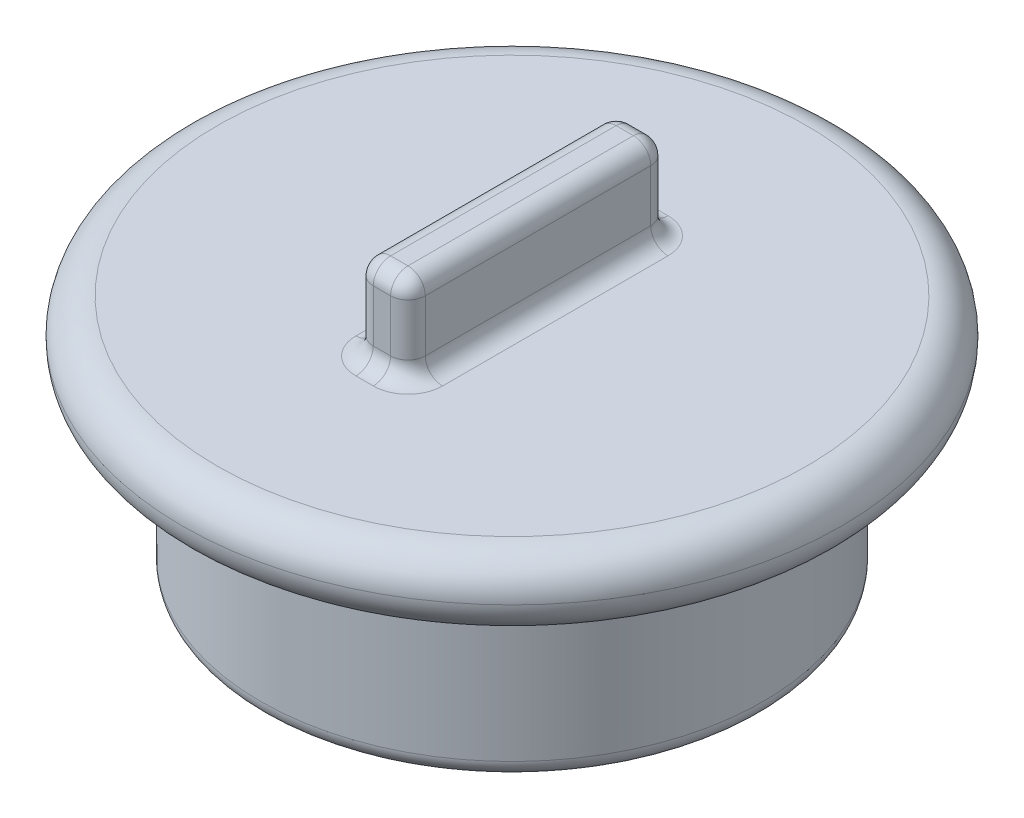
ISO-10303-21;
HEADER;
FILE_DESCRIPTION(('STEP AP214'),'2;1');
FILE_NAME('part.step','',(''),(''),'','','');
FILE_SCHEMA(('AUTOMOTIVE_DESIGN { 1 0 10303 214 1 1 1 1 }'));
ENDSEC;
DATA;
#1=APPLICATION_CONTEXT('core data for automotive mechanical design processes');
#2=APPLICATION_PROTOCOL_DEFINITION('international standard','automotive_design',2000,#1);
#3=PRODUCT_CONTEXT('',#1,'mechanical');
#4=PRODUCT('Part','Part','',(#3));
#5=PRODUCT_RELATED_PRODUCT_CATEGORY('part','',(#4));
#6=PRODUCT_DEFINITION_FORMATION('','',#4);
#7=PRODUCT_DEFINITION_CONTEXT('part definition',#1,'design');
#8=PRODUCT_DEFINITION('design','',#6,#7);
#9=PRODUCT_DEFINITION_SHAPE('','',#8);
#10=(LENGTH_UNIT() NAMED_UNIT(*) SI_UNIT(.MILLI.,.METRE.));
#11=(NAMED_UNIT(*) PLANE_ANGLE_UNIT() SI_UNIT($,.RADIAN.));
#12=(NAMED_UNIT(*) SI_UNIT($,.STERADIAN.) SOLID_ANGLE_UNIT());
#13=UNCERTAINTY_MEASURE_WITH_UNIT(LENGTH_MEASURE(1.E-05),#10,'distance_accuracy_value','');
#14=(GEOMETRIC_REPRESENTATION_CONTEXT(3) GLOBAL_UNCERTAINTY_ASSIGNED_CONTEXT((#13)) GLOBAL_UNIT_ASSIGNED_CONTEXT((#10,
#11,#12)) REPRESENTATION_CONTEXT('',''));
#15=CARTESIAN_POINT('',(0.,0.,0.));
#16=DIRECTION('',(0.,0.,1.));
#17=DIRECTION('',(1.,0.,0.));
#18=AXIS2_PLACEMENT_3D('',#15,#16,#17);
#19=CARTESIAN_POINT('',(0.,4.,0.));
#20=DIRECTION('',(0.,1.,0.));
#21=DIRECTION('',(0.,0.,1.));
#22=AXIS2_PLACEMENT_3D('',#19,#20,#21);
#23=PLANE('',#22);
#24=CARTESIAN_POINT('',(0.,4.,0.));
#25=DIRECTION('',(0.,1.,0.));
#26=DIRECTION('',(0.,0.,1.));
#27=AXIS2_PLACEMENT_3D('',#24,#25,#26);
#28=CIRCLE('',#27,17.);
#29=CARTESIAN_POINT('',(0.,4.,17.));
#30=VERTEX_POINT('',#29);
#31=EDGE_CURVE('E245',#30,#30,#28,.T.);
#32=ORIENTED_EDGE('',*,*,#31,.T.);
#33=EDGE_LOOP('',(#32));
#34=FACE_BOUND('',#33,.T.);
#35=CARTESIAN_POINT('',(0.500000000000001,4.,6.5));
#36=DIRECTION('',(0.,1.,0.));
#37=DIRECTION('',(0.,0.,1.));
#38=AXIS2_PLACEMENT_3D('',#35,#36,#37);
#39=CIRCLE('',#38,2.);
#40=CARTESIAN_POINT('',(0.500000000000001,4.,8.5));
#41=VERTEX_POINT('',#40);
#42=CARTESIAN_POINT('',(2.5,4.,6.5));
#43=VERTEX_POINT('',#42);
#44=EDGE_CURVE('E641',#41,#43,#39,.T.);
#45=ORIENTED_EDGE('',*,*,#44,.F.);
#46=DIRECTION('',(1.,0.,0.));
#47=VECTOR('',#46,1.);
#48=CARTESIAN_POINT('',(0.,4.,8.5));
#49=LINE('',#48,#47);
#50=CARTESIAN_POINT('',(-0.499999999999999,4.,8.5));
#51=VERTEX_POINT('',#50);
#52=EDGE_CURVE('E638',#41,#51,#49,.F.);
#53=ORIENTED_EDGE('',*,*,#52,.T.);
#54=CARTESIAN_POINT('',(-0.499999999999999,4.,6.5));
#55=DIRECTION('',(0.,1.,0.));
#56=DIRECTION('',(0.,0.,1.));
#57=AXIS2_PLACEMENT_3D('',#54,#55,#56);
#58=CIRCLE('',#57,2.);
#59=CARTESIAN_POINT('',(-2.5,4.,6.5));
#60=VERTEX_POINT('',#59);
#61=EDGE_CURVE('E634',#60,#51,#58,.T.);
#62=ORIENTED_EDGE('',*,*,#61,.F.);
#63=DIRECTION('',(0.,0.,1.));
#64=VECTOR('',#63,1.);
#65=CARTESIAN_POINT('',(-2.5,4.,0.));
#66=LINE('',#65,#64);
#67=CARTESIAN_POINT('',(-2.5,4.,-6.5));
#68=VERTEX_POINT('',#67);
#69=EDGE_CURVE('E620',#60,#68,#66,.F.);
#70=ORIENTED_EDGE('',*,*,#69,.T.);
#71=CARTESIAN_POINT('',(-0.500000000000001,4.,-6.5));
#72=DIRECTION('',(0.,1.,0.));
#73=DIRECTION('',(0.,0.,1.));
#74=AXIS2_PLACEMENT_3D('',#71,#72,#73);
#75=CIRCLE('',#74,2.);
#76=CARTESIAN_POINT('',(-0.5,4.,-8.5));
#77=VERTEX_POINT('',#76);
#78=EDGE_CURVE('E617',#77,#68,#75,.T.);
#79=ORIENTED_EDGE('',*,*,#78,.F.);
#80=DIRECTION('',(-1.,0.,0.));
#81=VECTOR('',#80,1.);
#82=CARTESIAN_POINT('',(0.,4.,-8.5));
#83=LINE('',#82,#81);
#84=CARTESIAN_POINT('',(0.5,4.,-8.5));
#85=VERTEX_POINT('',#84);
#86=EDGE_CURVE('E621',#77,#85,#83,.F.);
#87=ORIENTED_EDGE('',*,*,#86,.T.);
#88=CARTESIAN_POINT('',(0.499999999999999,4.,-6.5));
#89=DIRECTION('',(0.,1.,0.));
#90=DIRECTION('',(0.,0.,1.));
#91=AXIS2_PLACEMENT_3D('',#88,#89,#90);
#92=CIRCLE('',#91,2.);
#93=CARTESIAN_POINT('',(2.5,4.,-6.5));
#94=VERTEX_POINT('',#93);
#95=EDGE_CURVE('E627',#94,#85,#92,.T.);
#96=ORIENTED_EDGE('',*,*,#95,.F.);
#97=DIRECTION('',(0.,0.,-1.));
#98=VECTOR('',#97,1.);
#99=CARTESIAN_POINT('',(2.5,4.,0.));
#100=LINE('',#99,#98);
#101=EDGE_CURVE('E625',#94,#43,#100,.F.);
#102=ORIENTED_EDGE('',*,*,#101,.T.);
#103=EDGE_LOOP('',(#45,#53,#62,#70,#79,#87,#96,#102));
#104=FACE_BOUND('',#103,.T.);
#105=ADVANCED_FACE('F41',(#34,#104),#23,.T.);
#106=CARTESIAN_POINT('',(0.,0.,0.));
#107=DIRECTION('',(0.,1.,0.));
#108=DIRECTION('',(0.,0.,1.));
#109=AXIS2_PLACEMENT_3D('',#106,#107,#108);
#110=PLANE('',#109);
#111=CARTESIAN_POINT('',(0.,0.,0.));
#112=DIRECTION('',(0.,1.,0.));
#113=DIRECTION('',(0.,0.,1.));
#114=AXIS2_PLACEMENT_3D('',#111,#112,#113);
#115=CIRCLE('',#114,14.5);
#116=CARTESIAN_POINT('',(0.,0.,14.5));
#117=VERTEX_POINT('',#116);
#118=EDGE_CURVE('E249',#117,#117,#115,.F.);
#119=ORIENTED_EDGE('',*,*,#118,.F.);
#120=EDGE_LOOP('',(#119));
#121=FACE_BOUND('',#120,.T.);
#122=CARTESIAN_POINT('',(0.,0.,0.));
#123=DIRECTION('',(0.,1.,0.));
#124=DIRECTION('',(0.,0.,1.));
#125=AXIS2_PLACEMENT_3D('',#122,#123,#124);
#126=CIRCLE('',#125,17.);
#127=CARTESIAN_POINT('',(0.,0.,17.));
#128=VERTEX_POINT('',#127);
#129=EDGE_CURVE('E241',#128,#128,#126,.F.);
#130=ORIENTED_EDGE('',*,*,#129,.T.);
#131=EDGE_LOOP('',(#130));
#132=FACE_BOUND('',#131,.T.);
#133=ADVANCED_FACE('F277',(#121,#132),#110,.F.);
#134=CARTESIAN_POINT('',(-1.5,9.,-7.5));
#135=DIRECTION('',(1.,0.,0.));
#136=DIRECTION('',(0.,0.,-1.));
#137=AXIS2_PLACEMENT_3D('',#134,#135,#136);
#138=PLANE('',#137);
#139=DIRECTION('',(0.,-1.,0.));
#140=VECTOR('',#139,1.);
#141=CARTESIAN_POINT('',(-1.5,9.,-6.5));
#142=LINE('',#141,#140);
#143=CARTESIAN_POINT('',(-1.5,8.,-6.5));
#144=VERTEX_POINT('',#143);
#145=CARTESIAN_POINT('',(-1.5,5.,-6.5));
#146=VERTEX_POINT('',#145);
#147=EDGE_CURVE('E598',#144,#146,#142,.T.);
#148=ORIENTED_EDGE('',*,*,#147,.T.);
#149=DIRECTION('',(0.,0.,1.));
#150=VECTOR('',#149,1.);
#151=CARTESIAN_POINT('',(-1.5,5.,-7.5));
#152=LINE('',#151,#150);
#153=CARTESIAN_POINT('',(-1.5,5.,6.5));
#154=VERTEX_POINT('',#153);
#155=EDGE_CURVE('E600',#146,#154,#152,.T.);
#156=ORIENTED_EDGE('',*,*,#155,.T.);
#157=DIRECTION('',(0.,-1.,0.));
#158=VECTOR('',#157,1.);
#159=CARTESIAN_POINT('',(-1.5,9.,6.5));
#160=LINE('',#159,#158);
#161=CARTESIAN_POINT('',(-1.5,8.,6.5));
#162=VERTEX_POINT('',#161);
#163=EDGE_CURVE('E606',#154,#162,#160,.F.);
#164=ORIENTED_EDGE('',*,*,#163,.T.);
#165=DIRECTION('',(0.,0.,1.));
#166=VECTOR('',#165,1.);
#167=CARTESIAN_POINT('',(-1.5,8.,-7.5));
#168=LINE('',#167,#166);
#169=EDGE_CURVE('E602',#162,#144,#168,.F.);
#170=ORIENTED_EDGE('',*,*,#169,.T.);
#171=EDGE_LOOP('',(#148,#156,#164,#170));
#172=FACE_BOUND('',#171,.T.);
#173=ADVANCED_FACE('F283',(#172),#138,.F.);
#174=CARTESIAN_POINT('',(-1.5,9.,7.5));
#175=DIRECTION('',(0.,0.,-1.));
#176=DIRECTION('',(-1.,0.,0.));
#177=AXIS2_PLACEMENT_3D('',#174,#175,#176);
#178=PLANE('',#177);
#179=DIRECTION('',(1.,0.,0.));
#180=VECTOR('',#179,1.);
#181=CARTESIAN_POINT('',(-1.5,8.,7.5));
#182=LINE('',#181,#180);
#183=CARTESIAN_POINT('',(0.500000000000001,8.,7.5));
#184=VERTEX_POINT('',#183);
#185=CARTESIAN_POINT('',(-0.499999999999999,8.,7.5));
#186=VERTEX_POINT('',#185);
#187=EDGE_CURVE('E654',#184,#186,#182,.F.);
#188=ORIENTED_EDGE('',*,*,#187,.T.);
#189=DIRECTION('',(0.,-1.,0.));
#190=VECTOR('',#189,1.);
#191=CARTESIAN_POINT('',(-0.499999999999999,9.,7.5));
#192=LINE('',#191,#190);
#193=CARTESIAN_POINT('',(-0.499999999999999,5.,7.5));
#194=VERTEX_POINT('',#193);
#195=EDGE_CURVE('E657',#186,#194,#192,.T.);
#196=ORIENTED_EDGE('',*,*,#195,.T.);
#197=DIRECTION('',(1.,0.,0.));
#198=VECTOR('',#197,1.);
#199=CARTESIAN_POINT('',(-1.5,5.,7.5));
#200=LINE('',#199,#198);
#201=CARTESIAN_POINT('',(0.500000000000001,5.,7.5));
#202=VERTEX_POINT('',#201);
#203=EDGE_CURVE('E614',#194,#202,#200,.T.);
#204=ORIENTED_EDGE('',*,*,#203,.T.);
#205=DIRECTION('',(0.,-1.,0.));
#206=VECTOR('',#205,1.);
#207=CARTESIAN_POINT('',(0.500000000000001,9.,7.5));
#208=LINE('',#207,#206);
#209=EDGE_CURVE('E651',#202,#184,#208,.F.);
#210=ORIENTED_EDGE('',*,*,#209,.T.);
#211=EDGE_LOOP('',(#188,#196,#204,#210));
#212=FACE_BOUND('',#211,.T.);
#213=ADVANCED_FACE('F551',(#212),#178,.F.);
#214=CARTESIAN_POINT('',(1.5,9.,-7.5));
#215=DIRECTION('',(-1.,0.,0.));
#216=DIRECTION('',(0.,0.,1.));
#217=AXIS2_PLACEMENT_3D('',#214,#215,#216);
#218=PLANE('',#217);
#219=DIRECTION('',(0.,-1.,0.));
#220=VECTOR('',#219,1.);
#221=CARTESIAN_POINT('',(1.5,9.,6.5));
#222=LINE('',#221,#220);
#223=CARTESIAN_POINT('',(1.5,8.,6.5));
#224=VERTEX_POINT('',#223);
#225=CARTESIAN_POINT('',(1.5,5.,6.5));
#226=VERTEX_POINT('',#225);
#227=EDGE_CURVE('E155',#224,#226,#222,.T.);
#228=ORIENTED_EDGE('',*,*,#227,.T.);
#229=DIRECTION('',(0.,0.,-1.));
#230=VECTOR('',#229,1.);
#231=CARTESIAN_POINT('',(1.5,5.,-7.5));
#232=LINE('',#231,#230);
#233=CARTESIAN_POINT('',(1.5,5.,-6.5));
#234=VERTEX_POINT('',#233);
#235=EDGE_CURVE('E150',#226,#234,#232,.T.);
#236=ORIENTED_EDGE('',*,*,#235,.T.);
#237=DIRECTION('',(0.,-1.,0.));
#238=VECTOR('',#237,1.);
#239=CARTESIAN_POINT('',(1.5,9.,-6.5));
#240=LINE('',#239,#238);
#241=CARTESIAN_POINT('',(1.5,8.,-6.5));
#242=VERTEX_POINT('',#241);
#243=EDGE_CURVE('E144',#234,#242,#240,.F.);
#244=ORIENTED_EDGE('',*,*,#243,.T.);
#245=DIRECTION('',(0.,0.,-1.));
#246=VECTOR('',#245,1.);
#247=CARTESIAN_POINT('',(1.5,8.,7.5));
#248=LINE('',#247,#246);
#249=EDGE_CURVE('E147',#242,#224,#248,.F.);
#250=ORIENTED_EDGE('',*,*,#249,.T.);
#251=EDGE_LOOP('',(#228,#236,#244,#250));
#252=FACE_BOUND('',#251,.T.);
#253=ADVANCED_FACE('F146',(#252),#218,.F.);
#254=CARTESIAN_POINT('',(-1.5,9.,-7.5));
#255=DIRECTION('',(0.,0.,1.));
#256=DIRECTION('',(1.,0.,0.));
#257=AXIS2_PLACEMENT_3D('',#254,#255,#256);
#258=PLANE('',#257);
#259=DIRECTION('',(-1.,0.,0.));
#260=VECTOR('',#259,1.);
#261=CARTESIAN_POINT('',(1.5,8.,-7.5));
#262=LINE('',#261,#260);
#263=CARTESIAN_POINT('',(-0.5,8.,-7.5));
#264=VERTEX_POINT('',#263);
#265=CARTESIAN_POINT('',(0.499999999999999,8.,-7.5));
#266=VERTEX_POINT('',#265);
#267=EDGE_CURVE('E58',#264,#266,#262,.F.);
#268=ORIENTED_EDGE('',*,*,#267,.T.);
#269=DIRECTION('',(0.,-1.,0.));
#270=VECTOR('',#269,1.);
#271=CARTESIAN_POINT('',(0.499999999999999,9.,-7.5));
#272=LINE('',#271,#270);
#273=CARTESIAN_POINT('',(0.499999999999999,5.,-7.5));
#274=VERTEX_POINT('',#273);
#275=EDGE_CURVE('E178',#266,#274,#272,.T.);
#276=ORIENTED_EDGE('',*,*,#275,.T.);
#277=DIRECTION('',(-1.,0.,0.));
#278=VECTOR('',#277,1.);
#279=CARTESIAN_POINT('',(-1.5,5.,-7.5));
#280=LINE('',#279,#278);
#281=CARTESIAN_POINT('',(-0.5,5.,-7.5));
#282=VERTEX_POINT('',#281);
#283=EDGE_CURVE('E674',#274,#282,#280,.T.);
#284=ORIENTED_EDGE('',*,*,#283,.T.);
#285=DIRECTION('',(0.,-1.,0.));
#286=VECTOR('',#285,1.);
#287=CARTESIAN_POINT('',(-0.5,9.,-7.5));
#288=LINE('',#287,#286);
#289=EDGE_CURVE('E63',#282,#264,#288,.F.);
#290=ORIENTED_EDGE('',*,*,#289,.T.);
#291=EDGE_LOOP('',(#268,#276,#284,#290));
#292=FACE_BOUND('',#291,.T.);
#293=ADVANCED_FACE('F535',(#292),#258,.F.);
#294=CARTESIAN_POINT('',(0.,9.,0.));
#295=DIRECTION('',(0.,1.,0.));
#296=DIRECTION('',(0.,0.,1.));
#297=AXIS2_PLACEMENT_3D('',#294,#295,#296);
#298=PLANE('',#297);
#299=DIRECTION('',(-1.,0.,0.));
#300=VECTOR('',#299,1.);
#301=CARTESIAN_POINT('',(-1.5,9.,-6.5));
#302=LINE('',#301,#300);
#303=CARTESIAN_POINT('',(0.499999999999999,9.,-6.5));
#304=VERTEX_POINT('',#303);
#305=CARTESIAN_POINT('',(-0.500000000000001,9.,-6.5));
#306=VERTEX_POINT('',#305);
#307=EDGE_CURVE('E664',#304,#306,#302,.T.);
#308=ORIENTED_EDGE('',*,*,#307,.T.);
#309=DIRECTION('',(0.,0.,1.));
#310=VECTOR('',#309,1.);
#311=CARTESIAN_POINT('',(-0.499999999999999,9.,7.5));
#312=LINE('',#311,#310);
#313=CARTESIAN_POINT('',(-0.499999999999999,9.,6.5));
#314=VERTEX_POINT('',#313);
#315=EDGE_CURVE('E671',#306,#314,#312,.T.);
#316=ORIENTED_EDGE('',*,*,#315,.T.);
#317=DIRECTION('',(1.,0.,0.));
#318=VECTOR('',#317,1.);
#319=CARTESIAN_POINT('',(1.5,9.,6.5));
#320=LINE('',#319,#318);
#321=CARTESIAN_POINT('',(0.500000000000001,9.,6.5));
#322=VERTEX_POINT('',#321);
#323=EDGE_CURVE('E667',#314,#322,#320,.T.);
#324=ORIENTED_EDGE('',*,*,#323,.T.);
#325=DIRECTION('',(0.,0.,-1.));
#326=VECTOR('',#325,1.);
#327=CARTESIAN_POINT('',(0.499999999999999,9.,-7.5));
#328=LINE('',#327,#326);
#329=EDGE_CURVE('E661',#322,#304,#328,.T.);
#330=ORIENTED_EDGE('',*,*,#329,.T.);
#331=EDGE_LOOP('',(#308,#316,#324,#330));
#332=FACE_BOUND('',#331,.T.);
#333=ADVANCED_FACE('F364',(#332),#298,.T.);
#334=CARTESIAN_POINT('',(-0.5,8.,0.));
#335=DIRECTION('',(0.,0.,-1.));
#336=DIRECTION('',(-1.,0.,0.));
#337=AXIS2_PLACEMENT_3D('',#334,#335,#336);
#338=CYLINDRICAL_SURFACE('',#337,1.);
#339=CARTESIAN_POINT('',(-0.499999999999999,8.,6.5));
#340=DIRECTION('',(0.,0.,1.));
#341=DIRECTION('',(1.,0.,0.));
#342=AXIS2_PLACEMENT_3D('',#339,#340,#341);
#343=CIRCLE('',#342,1.);
#344=EDGE_CURVE('E167',#314,#162,#343,.T.);
#345=ORIENTED_EDGE('',*,*,#344,.F.);
#346=ORIENTED_EDGE('',*,*,#315,.F.);
#347=CARTESIAN_POINT('',(-0.500000000000001,8.,-6.5));
#348=DIRECTION('',(0.,0.,-1.));
#349=DIRECTION('',(-1.,0.,0.));
#350=AXIS2_PLACEMENT_3D('',#347,#348,#349);
#351=CIRCLE('',#350,1.);
#352=EDGE_CURVE('E234',#144,#306,#351,.T.);
#353=ORIENTED_EDGE('',*,*,#352,.F.);
#354=ORIENTED_EDGE('',*,*,#169,.F.);
#355=EDGE_LOOP('',(#345,#346,#353,#354));
#356=FACE_BOUND('',#355,.T.);
#357=ADVANCED_FACE('F360',(#356),#338,.T.);
#358=CARTESIAN_POINT('',(-0.499999999999999,8.,6.5));
#359=DIRECTION('',(-1.,0.,0.));
#360=DIRECTION('',(0.,0.,1.));
#361=AXIS2_PLACEMENT_3D('',#358,#359,#360);
#362=SPHERICAL_SURFACE('',#361,1.);
#363=CARTESIAN_POINT('',(-0.499999999999999,8.,6.5));
#364=DIRECTION('',(-1.,0.,0.));
#365=DIRECTION('',(0.,-1.,0.));
#366=AXIS2_PLACEMENT_3D('',#363,#364,#365);
#367=CIRCLE('',#366,1.);
#368=EDGE_CURVE('E226',#314,#186,#367,.F.);
#369=ORIENTED_EDGE('',*,*,#368,.F.);
#370=ORIENTED_EDGE('',*,*,#344,.T.);
#371=CARTESIAN_POINT('',(-0.499999999999999,8.,6.5));
#372=DIRECTION('',(0.,1.,0.));
#373=DIRECTION('',(0.,0.,1.));
#374=AXIS2_PLACEMENT_3D('',#371,#372,#373);
#375=CIRCLE('',#374,1.);
#376=EDGE_CURVE('E230',#186,#162,#375,.F.);
#377=ORIENTED_EDGE('',*,*,#376,.F.);
#378=EDGE_LOOP('',(#369,#370,#377));
#379=FACE_BOUND('',#378,.T.);
#380=ADVANCED_FACE('F356',(#379),#362,.T.);
#381=CARTESIAN_POINT('',(-0.500000000000001,8.,-6.5));
#382=DIRECTION('',(0.,1.,0.));
#383=DIRECTION('',(0.,0.,1.));
#384=AXIS2_PLACEMENT_3D('',#381,#382,#383);
#385=SPHERICAL_SURFACE('',#384,1.);
#386=CARTESIAN_POINT('',(-0.500000000000001,8.,-6.5));
#387=DIRECTION('',(0.,1.,0.));
#388=DIRECTION('',(0.,0.,1.));
#389=AXIS2_PLACEMENT_3D('',#386,#387,#388);
#390=CIRCLE('',#389,1.);
#391=EDGE_CURVE('E219',#144,#264,#390,.F.);
#392=ORIENTED_EDGE('',*,*,#391,.F.);
#393=ORIENTED_EDGE('',*,*,#352,.T.);
#394=CARTESIAN_POINT('',(-0.500000000000001,8.,-6.5));
#395=DIRECTION('',(-1.,0.,0.));
#396=DIRECTION('',(0.,0.,1.));
#397=AXIS2_PLACEMENT_3D('',#394,#395,#396);
#398=CIRCLE('',#397,1.);
#399=EDGE_CURVE('E222',#264,#306,#398,.F.);
#400=ORIENTED_EDGE('',*,*,#399,.F.);
#401=EDGE_LOOP('',(#392,#393,#400));
#402=FACE_BOUND('',#401,.T.);
#403=ADVANCED_FACE('F352',(#402),#385,.T.);
#404=CARTESIAN_POINT('',(-0.499999999999999,9.,6.5));
#405=DIRECTION('',(0.,-1.,0.));
#406=DIRECTION('',(0.,0.,-1.));
#407=AXIS2_PLACEMENT_3D('',#404,#405,#406);
#408=CYLINDRICAL_SURFACE('',#407,1.);
#409=ORIENTED_EDGE('',*,*,#376,.T.);
#410=ORIENTED_EDGE('',*,*,#163,.F.);
#411=CARTESIAN_POINT('',(-0.499999999999999,5.,6.5));
#412=DIRECTION('',(0.,1.,0.));
#413=DIRECTION('',(0.,0.,1.));
#414=AXIS2_PLACEMENT_3D('',#411,#412,#413);
#415=CIRCLE('',#414,1.);
#416=EDGE_CURVE('E212',#194,#154,#415,.F.);
#417=ORIENTED_EDGE('',*,*,#416,.F.);
#418=ORIENTED_EDGE('',*,*,#195,.F.);
#419=EDGE_LOOP('',(#409,#410,#417,#418));
#420=FACE_BOUND('',#419,.T.);
#421=ADVANCED_FACE('F348',(#420),#408,.T.);
#422=CARTESIAN_POINT('',(0.,8.,6.5));
#423=DIRECTION('',(-1.,0.,0.));
#424=DIRECTION('',(0.,0.,1.));
#425=AXIS2_PLACEMENT_3D('',#422,#423,#424);
#426=CYLINDRICAL_SURFACE('',#425,1.);
#427=ORIENTED_EDGE('',*,*,#368,.T.);
#428=ORIENTED_EDGE('',*,*,#187,.F.);
#429=CARTESIAN_POINT('',(0.500000000000001,8.,6.5));
#430=DIRECTION('',(1.,0.,0.));
#431=DIRECTION('',(0.,0.,-1.));
#432=AXIS2_PLACEMENT_3D('',#429,#430,#431);
#433=CIRCLE('',#432,1.);
#434=EDGE_CURVE('E208',#322,#184,#433,.T.);
#435=ORIENTED_EDGE('',*,*,#434,.F.);
#436=ORIENTED_EDGE('',*,*,#323,.F.);
#437=EDGE_LOOP('',(#427,#428,#435,#436));
#438=FACE_BOUND('',#437,.T.);
#439=ADVANCED_FACE('F345',(#438),#426,.T.);
#440=CARTESIAN_POINT('',(0.5,8.,0.));
#441=DIRECTION('',(0.,0.,1.));
#442=DIRECTION('',(1.,0.,0.));
#443=AXIS2_PLACEMENT_3D('',#440,#441,#442);
#444=CYLINDRICAL_SURFACE('',#443,1.);
#445=CARTESIAN_POINT('',(0.499999999999999,8.,-6.5));
#446=DIRECTION('',(0.,0.,-1.));
#447=DIRECTION('',(-1.,0.,0.));
#448=AXIS2_PLACEMENT_3D('',#445,#446,#447);
#449=CIRCLE('',#448,1.);
#450=EDGE_CURVE('E162',#304,#242,#449,.T.);
#451=ORIENTED_EDGE('',*,*,#450,.F.);
#452=ORIENTED_EDGE('',*,*,#329,.F.);
#453=CARTESIAN_POINT('',(0.500000000000001,8.,6.5));
#454=DIRECTION('',(0.,0.,1.));
#455=DIRECTION('',(0.,-1.,0.));
#456=AXIS2_PLACEMENT_3D('',#453,#454,#455);
#457=CIRCLE('',#456,1.);
#458=EDGE_CURVE('E164',#224,#322,#457,.T.);
#459=ORIENTED_EDGE('',*,*,#458,.F.);
#460=ORIENTED_EDGE('',*,*,#249,.F.);
#461=EDGE_LOOP('',(#451,#452,#459,#460));
#462=FACE_BOUND('',#461,.T.);
#463=ADVANCED_FACE('F160',(#462),#444,.T.);
#464=CARTESIAN_POINT('',(0.,8.,-6.5));
#465=DIRECTION('',(1.,0.,0.));
#466=DIRECTION('',(0.,0.,-1.));
#467=AXIS2_PLACEMENT_3D('',#464,#465,#466);
#468=CYLINDRICAL_SURFACE('',#467,1.);
#469=ORIENTED_EDGE('',*,*,#399,.T.);
#470=ORIENTED_EDGE('',*,*,#307,.F.);
#471=CARTESIAN_POINT('',(0.499999999999999,8.,-6.5));
#472=DIRECTION('',(1.,0.,0.));
#473=DIRECTION('',(0.,0.,-1.));
#474=AXIS2_PLACEMENT_3D('',#471,#472,#473);
#475=CIRCLE('',#474,1.);
#476=EDGE_CURVE('E174',#266,#304,#475,.T.);
#477=ORIENTED_EDGE('',*,*,#476,.F.);
#478=ORIENTED_EDGE('',*,*,#267,.F.);
#479=EDGE_LOOP('',(#469,#470,#477,#478));
#480=FACE_BOUND('',#479,.T.);
#481=ADVANCED_FACE('F338',(#480),#468,.T.);
#482=CARTESIAN_POINT('',(-0.500000000000001,9.,-6.5));
#483=DIRECTION('',(0.,-1.,0.));
#484=DIRECTION('',(0.,0.,-1.));
#485=AXIS2_PLACEMENT_3D('',#482,#483,#484);
#486=CYLINDRICAL_SURFACE('',#485,1.);
#487=ORIENTED_EDGE('',*,*,#391,.T.);
#488=ORIENTED_EDGE('',*,*,#289,.F.);
#489=CARTESIAN_POINT('',(-0.500000000000001,5.,-6.5));
#490=DIRECTION('',(0.,1.,0.));
#491=DIRECTION('',(0.,0.,1.));
#492=AXIS2_PLACEMENT_3D('',#489,#490,#491);
#493=CIRCLE('',#492,1.);
#494=EDGE_CURVE('E200',#146,#282,#493,.F.);
#495=ORIENTED_EDGE('',*,*,#494,.F.);
#496=ORIENTED_EDGE('',*,*,#147,.F.);
#497=EDGE_LOOP('',(#487,#488,#495,#496));
#498=FACE_BOUND('',#497,.T.);
#499=ADVANCED_FACE('F334',(#498),#486,.T.);
#500=CARTESIAN_POINT('',(-2.5,5.,-7.5));
#501=DIRECTION('',(0.,0.,1.));
#502=DIRECTION('',(1.,0.,0.));
#503=AXIS2_PLACEMENT_3D('',#500,#501,#502);
#504=CYLINDRICAL_SURFACE('',#503,1.);
#505=CARTESIAN_POINT('',(-2.5,5.,-6.5));
#506=DIRECTION('',(0.,0.,1.));
#507=DIRECTION('',(1.,0.,0.));
#508=AXIS2_PLACEMENT_3D('',#505,#506,#507);
#509=CIRCLE('',#508,1.);
#510=EDGE_CURVE('E196',#68,#146,#509,.T.);
#511=ORIENTED_EDGE('',*,*,#510,.F.);
#512=ORIENTED_EDGE('',*,*,#69,.F.);
#513=CARTESIAN_POINT('',(-2.5,5.,6.5));
#514=DIRECTION('',(0.,0.,-1.));
#515=DIRECTION('',(-1.,0.,0.));
#516=AXIS2_PLACEMENT_3D('',#513,#514,#515);
#517=CIRCLE('',#516,1.);
#518=EDGE_CURVE('E215',#154,#60,#517,.T.);
#519=ORIENTED_EDGE('',*,*,#518,.F.);
#520=ORIENTED_EDGE('',*,*,#155,.F.);
#521=EDGE_LOOP('',(#511,#512,#519,#520));
#522=FACE_BOUND('',#521,.T.);
#523=ADVANCED_FACE('F330',(#522),#504,.F.);
#524=CARTESIAN_POINT('',(-0.499999999999999,5.,6.5));
#525=DIRECTION('',(0.,1.,0.));
#526=DIRECTION('',(0.,0.,1.));
#527=AXIS2_PLACEMENT_3D('',#524,#525,#526);
#528=TOROIDAL_SURFACE('',#527,2.,1.);
#529=ORIENTED_EDGE('',*,*,#518,.T.);
#530=ORIENTED_EDGE('',*,*,#61,.T.);
#531=CARTESIAN_POINT('',(-0.499999999999999,5.,8.5));
#532=DIRECTION('',(1.,0.,0.));
#533=DIRECTION('',(0.,0.,-1.));
#534=AXIS2_PLACEMENT_3D('',#531,#532,#533);
#535=CIRCLE('',#534,1.);
#536=EDGE_CURVE('E186',#194,#51,#535,.F.);
#537=ORIENTED_EDGE('',*,*,#536,.F.);
#538=ORIENTED_EDGE('',*,*,#416,.T.);
#539=EDGE_LOOP('',(#529,#530,#537,#538));
#540=FACE_BOUND('',#539,.T.);
#541=ADVANCED_FACE('F326',(#540),#528,.F.);
#542=CARTESIAN_POINT('',(0.500000000000001,8.,6.5));
#543=DIRECTION('',(0.,1.,0.));
#544=DIRECTION('',(0.,0.,1.));
#545=AXIS2_PLACEMENT_3D('',#542,#543,#544);
#546=SPHERICAL_SURFACE('',#545,1.);
#547=ORIENTED_EDGE('',*,*,#458,.T.);
#548=ORIENTED_EDGE('',*,*,#434,.T.);
#549=CARTESIAN_POINT('',(0.500000000000001,8.,6.5));
#550=DIRECTION('',(0.,1.,0.));
#551=DIRECTION('',(0.,0.,1.));
#552=AXIS2_PLACEMENT_3D('',#549,#550,#551);
#553=CIRCLE('',#552,1.);
#554=EDGE_CURVE('E180',#224,#184,#553,.F.);
#555=ORIENTED_EDGE('',*,*,#554,.F.);
#556=EDGE_LOOP('',(#547,#548,#555));
#557=FACE_BOUND('',#556,.T.);
#558=ADVANCED_FACE('F323',(#557),#546,.T.);
#559=CARTESIAN_POINT('',(0.499999999999999,8.,-6.5));
#560=DIRECTION('',(0.,1.,0.));
#561=DIRECTION('',(0.,0.,1.));
#562=AXIS2_PLACEMENT_3D('',#559,#560,#561);
#563=SPHERICAL_SURFACE('',#562,1.);
#564=ORIENTED_EDGE('',*,*,#476,.T.);
#565=ORIENTED_EDGE('',*,*,#450,.T.);
#566=CARTESIAN_POINT('',(0.499999999999999,8.,-6.5));
#567=DIRECTION('',(0.,1.,0.));
#568=DIRECTION('',(0.,0.,1.));
#569=AXIS2_PLACEMENT_3D('',#566,#567,#568);
#570=CIRCLE('',#569,1.);
#571=EDGE_CURVE('E172',#266,#242,#570,.F.);
#572=ORIENTED_EDGE('',*,*,#571,.F.);
#573=EDGE_LOOP('',(#564,#565,#572));
#574=FACE_BOUND('',#573,.T.);
#575=ADVANCED_FACE('F171',(#574),#563,.T.);
#576=CARTESIAN_POINT('',(-0.500000000000001,5.,-6.5));
#577=DIRECTION('',(0.,1.,0.));
#578=DIRECTION('',(0.,0.,1.));
#579=AXIS2_PLACEMENT_3D('',#576,#577,#578);
#580=TOROIDAL_SURFACE('',#579,2.,1.);
#581=ORIENTED_EDGE('',*,*,#510,.T.);
#582=ORIENTED_EDGE('',*,*,#494,.T.);
#583=CARTESIAN_POINT('',(-0.5,5.,-8.5));
#584=DIRECTION('',(1.,0.,0.));
#585=DIRECTION('',(0.,0.,-1.));
#586=AXIS2_PLACEMENT_3D('',#583,#584,#585);
#587=CIRCLE('',#586,1.);
#588=EDGE_CURVE('E181',#77,#282,#587,.F.);
#589=ORIENTED_EDGE('',*,*,#588,.F.);
#590=ORIENTED_EDGE('',*,*,#78,.T.);
#591=EDGE_LOOP('',(#581,#582,#589,#590));
#592=FACE_BOUND('',#591,.T.);
#593=ADVANCED_FACE('F316',(#592),#580,.F.);
#594=CARTESIAN_POINT('',(-1.5,5.,8.5));
#595=DIRECTION('',(1.,0.,0.));
#596=DIRECTION('',(0.,0.,-1.));
#597=AXIS2_PLACEMENT_3D('',#594,#595,#596);
#598=CYLINDRICAL_SURFACE('',#597,1.);
#599=ORIENTED_EDGE('',*,*,#536,.T.);
#600=ORIENTED_EDGE('',*,*,#52,.F.);
#601=CARTESIAN_POINT('',(0.500000000000001,5.,8.5));
#602=DIRECTION('',(-1.,0.,0.));
#603=DIRECTION('',(0.,0.,1.));
#604=AXIS2_PLACEMENT_3D('',#601,#602,#603);
#605=CIRCLE('',#604,1.);
#606=EDGE_CURVE('E189',#202,#41,#605,.T.);
#607=ORIENTED_EDGE('',*,*,#606,.F.);
#608=ORIENTED_EDGE('',*,*,#203,.F.);
#609=EDGE_LOOP('',(#599,#600,#607,#608));
#610=FACE_BOUND('',#609,.T.);
#611=ADVANCED_FACE('F312',(#610),#598,.F.);
#612=CARTESIAN_POINT('',(0.500000000000001,9.,6.5));
#613=DIRECTION('',(0.,-1.,0.));
#614=DIRECTION('',(0.,0.,-1.));
#615=AXIS2_PLACEMENT_3D('',#612,#613,#614);
#616=CYLINDRICAL_SURFACE('',#615,1.);
#617=ORIENTED_EDGE('',*,*,#554,.T.);
#618=ORIENTED_EDGE('',*,*,#209,.F.);
#619=CARTESIAN_POINT('',(0.500000000000001,5.,6.5));
#620=DIRECTION('',(0.,1.,0.));
#621=DIRECTION('',(0.,0.,1.));
#622=AXIS2_PLACEMENT_3D('',#619,#620,#621);
#623=CIRCLE('',#622,1.);
#624=EDGE_CURVE('E695',#226,#202,#623,.F.);
#625=ORIENTED_EDGE('',*,*,#624,.F.);
#626=ORIENTED_EDGE('',*,*,#227,.F.);
#627=EDGE_LOOP('',(#617,#618,#625,#626));
#628=FACE_BOUND('',#627,.T.);
#629=ADVANCED_FACE('F309',(#628),#616,.T.);
#630=CARTESIAN_POINT('',(0.499999999999999,9.,-6.5));
#631=DIRECTION('',(0.,-1.,0.));
#632=DIRECTION('',(0.,0.,-1.));
#633=AXIS2_PLACEMENT_3D('',#630,#631,#632);
#634=CYLINDRICAL_SURFACE('',#633,1.);
#635=ORIENTED_EDGE('',*,*,#571,.T.);
#636=ORIENTED_EDGE('',*,*,#243,.F.);
#637=CARTESIAN_POINT('',(0.499999999999999,5.,-6.5));
#638=DIRECTION('',(0.,1.,0.));
#639=DIRECTION('',(0.,0.,1.));
#640=AXIS2_PLACEMENT_3D('',#637,#638,#639);
#641=CIRCLE('',#640,1.);
#642=EDGE_CURVE('E691',#274,#234,#641,.F.);
#643=ORIENTED_EDGE('',*,*,#642,.F.);
#644=ORIENTED_EDGE('',*,*,#275,.F.);
#645=EDGE_LOOP('',(#635,#636,#643,#644));
#646=FACE_BOUND('',#645,.T.);
#647=ADVANCED_FACE('F177',(#646),#634,.T.);
#648=CARTESIAN_POINT('',(-1.5,5.,-8.5));
#649=DIRECTION('',(-1.,0.,0.));
#650=DIRECTION('',(0.,0.,1.));
#651=AXIS2_PLACEMENT_3D('',#648,#649,#650);
#652=CYLINDRICAL_SURFACE('',#651,1.);
#653=ORIENTED_EDGE('',*,*,#588,.T.);
#654=ORIENTED_EDGE('',*,*,#283,.F.);
#655=CARTESIAN_POINT('',(0.5,5.,-8.5));
#656=DIRECTION('',(-1.,0.,0.));
#657=DIRECTION('',(0.,0.,1.));
#658=AXIS2_PLACEMENT_3D('',#655,#656,#657);
#659=CIRCLE('',#658,1.);
#660=EDGE_CURVE('E688',#85,#274,#659,.T.);
#661=ORIENTED_EDGE('',*,*,#660,.F.);
#662=ORIENTED_EDGE('',*,*,#86,.F.);
#663=EDGE_LOOP('',(#653,#654,#661,#662));
#664=FACE_BOUND('',#663,.T.);
#665=ADVANCED_FACE('F302',(#664),#652,.F.);
#666=CARTESIAN_POINT('',(0.500000000000001,5.,6.5));
#667=DIRECTION('',(0.,1.,0.));
#668=DIRECTION('',(0.,0.,1.));
#669=AXIS2_PLACEMENT_3D('',#666,#667,#668);
#670=TOROIDAL_SURFACE('',#669,2.,1.);
#671=ORIENTED_EDGE('',*,*,#606,.T.);
#672=ORIENTED_EDGE('',*,*,#44,.T.);
#673=CARTESIAN_POINT('',(2.5,5.,6.5));
#674=DIRECTION('',(0.,0.,-1.));
#675=DIRECTION('',(-1.,0.,0.));
#676=AXIS2_PLACEMENT_3D('',#673,#674,#675);
#677=CIRCLE('',#676,1.);
#678=EDGE_CURVE('E685',#226,#43,#677,.F.);
#679=ORIENTED_EDGE('',*,*,#678,.F.);
#680=ORIENTED_EDGE('',*,*,#624,.T.);
#681=EDGE_LOOP('',(#671,#672,#679,#680));
#682=FACE_BOUND('',#681,.T.);
#683=ADVANCED_FACE('F298',(#682),#670,.F.);
#684=CARTESIAN_POINT('',(0.499999999999999,5.,-6.5));
#685=DIRECTION('',(0.,1.,0.));
#686=DIRECTION('',(0.,0.,1.));
#687=AXIS2_PLACEMENT_3D('',#684,#685,#686);
#688=TOROIDAL_SURFACE('',#687,2.,1.);
#689=ORIENTED_EDGE('',*,*,#660,.T.);
#690=ORIENTED_EDGE('',*,*,#642,.T.);
#691=CARTESIAN_POINT('',(2.5,5.,-6.5));
#692=DIRECTION('',(0.,0.,1.));
#693=DIRECTION('',(1.,0.,0.));
#694=AXIS2_PLACEMENT_3D('',#691,#692,#693);
#695=CIRCLE('',#694,1.);
#696=EDGE_CURVE('E254',#94,#234,#695,.F.);
#697=ORIENTED_EDGE('',*,*,#696,.F.);
#698=ORIENTED_EDGE('',*,*,#95,.T.);
#699=EDGE_LOOP('',(#689,#690,#697,#698));
#700=FACE_BOUND('',#699,.T.);
#701=ADVANCED_FACE('F294',(#700),#688,.F.);
#702=CARTESIAN_POINT('',(2.5,5.,-7.5));
#703=DIRECTION('',(0.,0.,-1.));
#704=DIRECTION('',(-1.,0.,0.));
#705=AXIS2_PLACEMENT_3D('',#702,#703,#704);
#706=CYLINDRICAL_SURFACE('',#705,1.);
#707=ORIENTED_EDGE('',*,*,#678,.T.);
#708=ORIENTED_EDGE('',*,*,#101,.F.);
#709=ORIENTED_EDGE('',*,*,#696,.T.);
#710=ORIENTED_EDGE('',*,*,#235,.F.);
#711=EDGE_LOOP('',(#707,#708,#709,#710));
#712=FACE_BOUND('',#711,.T.);
#713=ADVANCED_FACE('F290',(#712),#706,.F.);
#714=CARTESIAN_POINT('',(0.,2.,0.));
#715=DIRECTION('',(0.,1.,0.));
#716=DIRECTION('',(0.,0.,1.));
#717=AXIS2_PLACEMENT_3D('',#714,#715,#716);
#718=TOROIDAL_SURFACE('',#717,17.,2.);
#719=ORIENTED_EDGE('',*,*,#31,.F.);
#720=EDGE_LOOP('',(#719));
#721=FACE_BOUND('',#720,.T.);
#722=CARTESIAN_POINT('',(0.,2.,0.));
#723=DIRECTION('',(0.,1.,0.));
#724=DIRECTION('',(0.,0.,1.));
#725=AXIS2_PLACEMENT_3D('',#722,#723,#724);
#726=CIRCLE('',#725,19.);
#727=CARTESIAN_POINT('',(0.,2.,19.));
#728=VERTEX_POINT('',#727);
#729=EDGE_CURVE('E250',#728,#728,#726,.F.);
#730=ORIENTED_EDGE('',*,*,#729,.F.);
#731=EDGE_LOOP('',(#730));
#732=FACE_BOUND('',#731,.T.);
#733=ADVANCED_FACE('F293',(#721,#732),#718,.T.);
#734=CARTESIAN_POINT('',(0.,2.,0.));
#735=DIRECTION('',(0.,1.,0.));
#736=DIRECTION('',(0.,0.,1.));
#737=AXIS2_PLACEMENT_3D('',#734,#735,#736);
#738=TOROIDAL_SURFACE('',#737,17.,2.);
#739=ORIENTED_EDGE('',*,*,#129,.F.);
#740=EDGE_LOOP('',(#739));
#741=FACE_BOUND('',#740,.T.);
#742=ORIENTED_EDGE('',*,*,#729,.T.);
#743=EDGE_LOOP('',(#742));
#744=FACE_BOUND('',#743,.T.);
#745=ADVANCED_FACE('F366',(#741,#744),#738,.T.);
#746=CARTESIAN_POINT('',(0.,-10.,0.));
#747=DIRECTION('',(0.,1.,0.));
#748=DIRECTION('',(0.,0.,1.));
#749=AXIS2_PLACEMENT_3D('',#746,#747,#748);
#750=CYLINDRICAL_SURFACE('',#749,14.5);
#751=CARTESIAN_POINT('',(0.,-9.,0.));
#752=DIRECTION('',(0.,-1.,0.));
#753=DIRECTION('',(0.,0.,-1.));
#754=AXIS2_PLACEMENT_3D('',#751,#752,#753);
#755=CIRCLE('',#754,14.5);
#756=CARTESIAN_POINT('',(0.,-9.,-14.5));
#757=VERTEX_POINT('',#756);
#758=EDGE_CURVE('E11',#757,#757,#755,.F.);
#759=ORIENTED_EDGE('',*,*,#758,.T.);
#760=EDGE_LOOP('',(#759));
#761=FACE_BOUND('',#760,.T.);
#762=ORIENTED_EDGE('',*,*,#118,.T.);
#763=EDGE_LOOP('',(#762));
#764=FACE_BOUND('',#763,.T.);
#765=ADVANCED_FACE('F368',(#761,#764),#750,.T.);
#766=CARTESIAN_POINT('',(0.,-10.,0.));
#767=DIRECTION('',(0.,1.,0.));
#768=DIRECTION('',(0.,0.,1.));
#769=AXIS2_PLACEMENT_3D('',#766,#767,#768);
#770=CYLINDRICAL_SURFACE('',#769,12.5);
#771=CARTESIAN_POINT('',(0.,-9.,0.));
#772=DIRECTION('',(0.,-1.,0.));
#773=DIRECTION('',(0.,0.,-1.));
#774=AXIS2_PLACEMENT_3D('',#771,#772,#773);
#775=CIRCLE('',#774,12.5);
#776=CARTESIAN_POINT('',(0.,-9.,-12.5));
#777=VERTEX_POINT('',#776);
#778=EDGE_CURVE('E51',#777,#777,#775,.T.);
#779=ORIENTED_EDGE('',*,*,#778,.T.);
#780=EDGE_LOOP('',(#779));
#781=FACE_BOUND('',#780,.T.);
#782=CARTESIAN_POINT('',(0.,0.,0.));
#783=DIRECTION('',(0.,-1.,0.));
#784=DIRECTION('',(0.,0.,-1.));
#785=AXIS2_PLACEMENT_3D('',#782,#783,#784);
#786=CIRCLE('',#785,12.5);
#787=CARTESIAN_POINT('',(0.,0.,-12.5));
#788=VERTEX_POINT('',#787);
#789=EDGE_CURVE('E255',#788,#788,#786,.T.);
#790=ORIENTED_EDGE('',*,*,#789,.F.);
#791=EDGE_LOOP('',(#790));
#792=FACE_BOUND('',#791,.T.);
#793=ADVANCED_FACE('F263',(#781,#792),#770,.F.);
#794=ORIENTED_EDGE('',*,*,#789,.T.);
#795=EDGE_LOOP('',(#794));
#796=FACE_BOUND('',#795,.T.);
#797=ADVANCED_FACE('F272',(#796),#110,.F.);
#798=CARTESIAN_POINT('',(0.,-9.,0.));
#799=DIRECTION('',(0.,-1.,0.));
#800=DIRECTION('',(0.,0.,-1.));
#801=AXIS2_PLACEMENT_3D('',#798,#799,#800);
#802=TOROIDAL_SURFACE('',#801,13.5,1.);
#803=ORIENTED_EDGE('',*,*,#758,.F.);
#804=EDGE_LOOP('',(#803));
#805=FACE_BOUND('',#804,.T.);
#806=CARTESIAN_POINT('',(0.,-10.,0.));
#807=DIRECTION('',(0.,-1.,0.));
#808=DIRECTION('',(0.,0.,-1.));
#809=AXIS2_PLACEMENT_3D('',#806,#807,#808);
#810=CIRCLE('',#809,13.5);
#811=CARTESIAN_POINT('',(0.,-10.,-13.5));
#812=VERTEX_POINT('',#811);
#813=EDGE_CURVE('E45',#812,#812,#810,.T.);
#814=ORIENTED_EDGE('',*,*,#813,.F.);
#815=EDGE_LOOP('',(#814));
#816=FACE_BOUND('',#815,.T.);
#817=ADVANCED_FACE('F43',(#805,#816),#802,.T.);
#818=CARTESIAN_POINT('',(0.,-9.,0.));
#819=DIRECTION('',(0.,-1.,0.));
#820=DIRECTION('',(0.,0.,-1.));
#821=AXIS2_PLACEMENT_3D('',#818,#819,#820);
#822=TOROIDAL_SURFACE('',#821,13.5,1.);
#823=ORIENTED_EDGE('',*,*,#813,.T.);
#824=EDGE_LOOP('',(#823));
#825=FACE_BOUND('',#824,.T.);
#826=ORIENTED_EDGE('',*,*,#778,.F.);
#827=EDGE_LOOP('',(#826));
#828=FACE_BOUND('',#827,.T.);
#829=ADVANCED_FACE('F266',(#825,#828),#822,.T.);
#830=CLOSED_SHELL('',(#105,#133,#173,#213,#253,#293,#333,#357,#380,#403,#421,#439,#463,#481,
#499,#523,#541,#558,#575,#593,#611,#629,#647,#665,#683,#701,#713,#733,#745,#765,#793,#797,#817,#829));
#831=MANIFOLD_SOLID_BREP('B2',#830);
#832=ADVANCED_BREP_SHAPE_REPRESENTATION('',(#18,#831),#14);
#833=SHAPE_DEFINITION_REPRESENTATION(#9,#832);
ENDSEC;
END-ISO-10303-21;
